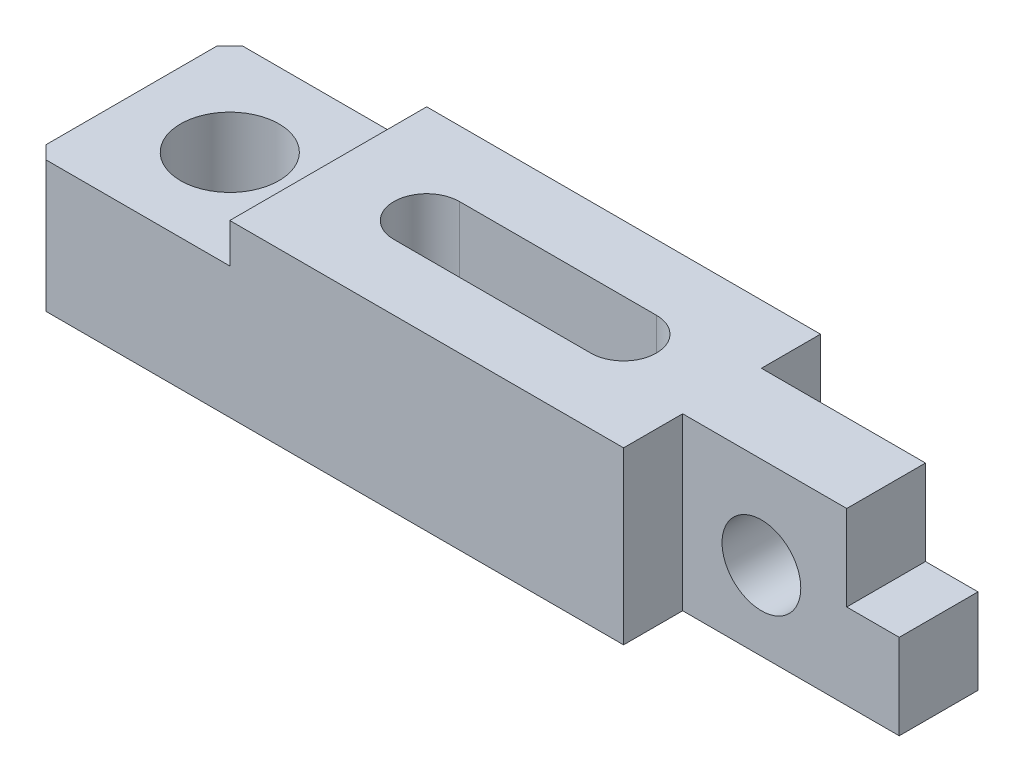
ISO-10303-21;
HEADER;
FILE_DESCRIPTION(('STEP AP214'),'2;1');
FILE_NAME('part.step','',(''),(''),'','','');
FILE_SCHEMA(('AUTOMOTIVE_DESIGN { 1 0 10303 214 1 1 1 1 }'));
ENDSEC;
DATA;
#1=APPLICATION_CONTEXT('core data for automotive mechanical design processes');
#2=APPLICATION_PROTOCOL_DEFINITION('international standard','automotive_design',2000,#1);
#3=PRODUCT_CONTEXT('',#1,'mechanical');
#4=PRODUCT('Part','Part','',(#3));
#5=PRODUCT_RELATED_PRODUCT_CATEGORY('part','',(#4));
#6=PRODUCT_DEFINITION_FORMATION('','',#4);
#7=PRODUCT_DEFINITION_CONTEXT('part definition',#1,'design');
#8=PRODUCT_DEFINITION('design','',#6,#7);
#9=PRODUCT_DEFINITION_SHAPE('','',#8);
#10=(LENGTH_UNIT() NAMED_UNIT(*) SI_UNIT(.MILLI.,.METRE.));
#11=(NAMED_UNIT(*) PLANE_ANGLE_UNIT() SI_UNIT($,.RADIAN.));
#12=(NAMED_UNIT(*) SI_UNIT($,.STERADIAN.) SOLID_ANGLE_UNIT());
#13=UNCERTAINTY_MEASURE_WITH_UNIT(LENGTH_MEASURE(1.E-05),#10,'distance_accuracy_value','');
#14=(GEOMETRIC_REPRESENTATION_CONTEXT(3) GLOBAL_UNCERTAINTY_ASSIGNED_CONTEXT((#13)) GLOBAL_UNIT_ASSIGNED_CONTEXT((#10,
#11,#12)) REPRESENTATION_CONTEXT('',''));
#15=CARTESIAN_POINT('',(0.,0.,0.));
#16=DIRECTION('',(0.,0.,1.));
#17=DIRECTION('',(1.,0.,0.));
#18=AXIS2_PLACEMENT_3D('',#15,#16,#17);
#19=CARTESIAN_POINT('',(123.,-0.001000000000001,6.));
#20=DIRECTION('',(0.,0.,-1.));
#21=DIRECTION('',(-1.,0.,0.));
#22=AXIS2_PLACEMENT_3D('',#19,#20,#21);
#23=PLANE('',#22);
#24=DIRECTION('',(1.,0.,0.));
#25=VECTOR('',#24,1.);
#26=CARTESIAN_POINT('',(123.,0.,6.));
#27=LINE('',#26,#25);
#28=CARTESIAN_POINT('',(90.,0.,6.));
#29=VERTEX_POINT('',#28);
#30=CARTESIAN_POINT('',(123.,0.,6.));
#31=VERTEX_POINT('',#30);
#32=EDGE_CURVE('E281',#29,#31,#27,.T.);
#33=ORIENTED_EDGE('',*,*,#32,.T.);
#34=DIRECTION('',(0.,1.,0.));
#35=VECTOR('',#34,1.);
#36=CARTESIAN_POINT('',(123.,-0.001000000000001,6.));
#37=LINE('',#36,#35);
#38=CARTESIAN_POINT('',(123.,13.,6.));
#39=VERTEX_POINT('',#38);
#40=EDGE_CURVE('E266',#31,#39,#37,.T.);
#41=ORIENTED_EDGE('',*,*,#40,.T.);
#42=DIRECTION('',(-1.,0.,0.));
#43=VECTOR('',#42,1.);
#44=CARTESIAN_POINT('',(123.,13.,6.));
#45=LINE('',#44,#43);
#46=CARTESIAN_POINT('',(115.,13.,6.));
#47=VERTEX_POINT('',#46);
#48=EDGE_CURVE('E284',#39,#47,#45,.T.);
#49=ORIENTED_EDGE('',*,*,#48,.T.);
#50=DIRECTION('',(0.,1.,0.));
#51=VECTOR('',#50,1.);
#52=CARTESIAN_POINT('',(115.,-0.001000000000001,6.));
#53=LINE('',#52,#51);
#54=CARTESIAN_POINT('',(115.,26.,6.));
#55=VERTEX_POINT('',#54);
#56=EDGE_CURVE('E232',#47,#55,#53,.T.);
#57=ORIENTED_EDGE('',*,*,#56,.T.);
#58=DIRECTION('',(-1.,0.,0.));
#59=VECTOR('',#58,1.);
#60=CARTESIAN_POINT('',(123.,26.,6.));
#61=LINE('',#60,#59);
#62=CARTESIAN_POINT('',(90.,26.,6.));
#63=VERTEX_POINT('',#62);
#64=EDGE_CURVE('E265',#55,#63,#61,.T.);
#65=ORIENTED_EDGE('',*,*,#64,.T.);
#66=DIRECTION('',(0.,1.,0.));
#67=VECTOR('',#66,1.);
#68=CARTESIAN_POINT('',(90.,-0.001000000000001,6.));
#69=LINE('',#68,#67);
#70=EDGE_CURVE('E195',#29,#63,#69,.T.);
#71=ORIENTED_EDGE('',*,*,#70,.F.);
#72=EDGE_LOOP('',(#33,#41,#49,#57,#65,#71));
#73=FACE_BOUND('',#72,.T.);
#74=CARTESIAN_POINT('',(102.,12.,6.00000000000002));
#75=DIRECTION('',(0.,0.,1.));
#76=DIRECTION('',(1.,0.,0.));
#77=AXIS2_PLACEMENT_3D('',#74,#75,#76);
#78=CIRCLE('',#77,6.00000000000001);
#79=CARTESIAN_POINT('',(108.,12.,6.00000000000002));
#80=VERTEX_POINT('',#79);
#81=EDGE_CURVE('E479',#80,#80,#78,.T.);
#82=ORIENTED_EDGE('',*,*,#81,.F.);
#83=EDGE_LOOP('',(#82));
#84=FACE_BOUND('',#83,.T.);
#85=ADVANCED_FACE('F45',(#73,#84),#23,.F.);
#86=CARTESIAN_POINT('',(0.,20.,15.));
#87=DIRECTION('',(0.,-1.,0.));
#88=DIRECTION('',(0.,0.,-1.));
#89=AXIS2_PLACEMENT_3D('',#86,#87,#88);
#90=PLANE('',#89);
#91=CARTESIAN_POINT('',(15.,20.,0.));
#92=DIRECTION('',(0.,1.,0.));
#93=DIRECTION('',(0.,0.,1.));
#94=AXIS2_PLACEMENT_3D('',#91,#92,#93);
#95=CIRCLE('',#94,7.49999999999999);
#96=CARTESIAN_POINT('',(15.,20.,7.49999999999999));
#97=VERTEX_POINT('',#96);
#98=EDGE_CURVE('E483',#97,#97,#95,.T.);
#99=ORIENTED_EDGE('',*,*,#98,.F.);
#100=EDGE_LOOP('',(#99));
#101=FACE_BOUND('',#100,.T.);
#102=DIRECTION('',(0.,0.,-1.));
#103=VECTOR('',#102,1.);
#104=CARTESIAN_POINT('',(0.,20.,15.));
#105=LINE('',#104,#103);
#106=CARTESIAN_POINT('',(0.,20.,13.));
#107=VERTEX_POINT('',#106);
#108=CARTESIAN_POINT('',(0.,20.,-13.));
#109=VERTEX_POINT('',#108);
#110=EDGE_CURVE('E341',#107,#109,#105,.T.);
#111=ORIENTED_EDGE('',*,*,#110,.F.);
#112=DIRECTION('',(0.70710678118655,0.,0.707106781186545));
#113=VECTOR('',#112,1.);
#114=CARTESIAN_POINT('',(2.,20.,15.));
#115=LINE('',#114,#113);
#116=CARTESIAN_POINT('',(2.,20.,15.));
#117=VERTEX_POINT('',#116);
#118=EDGE_CURVE('E55',#107,#117,#115,.T.);
#119=ORIENTED_EDGE('',*,*,#118,.T.);
#120=DIRECTION('',(-1.,0.,0.));
#121=VECTOR('',#120,1.);
#122=CARTESIAN_POINT('',(0.,20.,15.));
#123=LINE('',#122,#121);
#124=CARTESIAN_POINT('',(30.,20.,15.));
#125=VERTEX_POINT('',#124);
#126=EDGE_CURVE('E289',#125,#117,#123,.T.);
#127=ORIENTED_EDGE('',*,*,#126,.F.);
#128=DIRECTION('',(0.,0.,-1.));
#129=VECTOR('',#128,1.);
#130=CARTESIAN_POINT('',(30.,20.,15.));
#131=LINE('',#130,#129);
#132=CARTESIAN_POINT('',(30.,20.,-15.));
#133=VERTEX_POINT('',#132);
#134=EDGE_CURVE('E303',#125,#133,#131,.T.);
#135=ORIENTED_EDGE('',*,*,#134,.T.);
#136=DIRECTION('',(-1.,0.,0.));
#137=VECTOR('',#136,1.);
#138=CARTESIAN_POINT('',(0.,20.,-15.));
#139=LINE('',#138,#137);
#140=CARTESIAN_POINT('',(2.,20.,-15.));
#141=VERTEX_POINT('',#140);
#142=EDGE_CURVE('E254',#133,#141,#139,.T.);
#143=ORIENTED_EDGE('',*,*,#142,.T.);
#144=DIRECTION('',(0.70710678118655,0.,-0.707106781186545));
#145=VECTOR('',#144,1.);
#146=CARTESIAN_POINT('',(0.,20.,-13.));
#147=LINE('',#146,#145);
#148=EDGE_CURVE('E67',#141,#109,#147,.F.);
#149=ORIENTED_EDGE('',*,*,#148,.T.);
#150=EDGE_LOOP('',(#111,#119,#127,#135,#143,#149));
#151=FACE_BOUND('',#150,.T.);
#152=ADVANCED_FACE('F365',(#101,#151),#90,.F.);
#153=CARTESIAN_POINT('',(0.,0.,15.));
#154=DIRECTION('',(1.,0.,0.));
#155=DIRECTION('',(0.,0.,-1.));
#156=AXIS2_PLACEMENT_3D('',#153,#154,#155);
#157=PLANE('',#156);
#158=DIRECTION('',(0.,0.,-1.));
#159=VECTOR('',#158,1.);
#160=CARTESIAN_POINT('',(0.,0.,15.));
#161=LINE('',#160,#159);
#162=CARTESIAN_POINT('',(0.,0.,13.));
#163=VERTEX_POINT('',#162);
#164=CARTESIAN_POINT('',(0.,0.,-13.));
#165=VERTEX_POINT('',#164);
#166=EDGE_CURVE('E337',#163,#165,#161,.T.);
#167=ORIENTED_EDGE('',*,*,#166,.F.);
#168=DIRECTION('',(0.,1.,0.));
#169=VECTOR('',#168,1.);
#170=CARTESIAN_POINT('',(0.,20.,13.));
#171=LINE('',#170,#169);
#172=EDGE_CURVE('E358',#163,#107,#171,.T.);
#173=ORIENTED_EDGE('',*,*,#172,.T.);
#174=ORIENTED_EDGE('',*,*,#110,.T.);
#175=DIRECTION('',(0.,-1.,0.));
#176=VECTOR('',#175,1.);
#177=CARTESIAN_POINT('',(0.,0.,-13.));
#178=LINE('',#177,#176);
#179=EDGE_CURVE('E354',#109,#165,#178,.T.);
#180=ORIENTED_EDGE('',*,*,#179,.T.);
#181=EDGE_LOOP('',(#167,#173,#174,#180));
#182=FACE_BOUND('',#181,.T.);
#183=ADVANCED_FACE('F378',(#182),#157,.F.);
#184=CARTESIAN_POINT('',(123.,0.,15.));
#185=DIRECTION('',(0.,1.,0.));
#186=DIRECTION('',(-1.,0.,0.));
#187=AXIS2_PLACEMENT_3D('',#184,#185,#186);
#188=PLANE('',#187);
#189=CARTESIAN_POINT('',(15.,0.,0.));
#190=DIRECTION('',(0.,1.,0.));
#191=DIRECTION('',(0.,0.,1.));
#192=AXIS2_PLACEMENT_3D('',#189,#190,#191);
#193=CIRCLE('',#192,7.5);
#194=CARTESIAN_POINT('',(15.,0.,7.5));
#195=VERTEX_POINT('',#194);
#196=EDGE_CURVE('E489',#195,#195,#193,.T.);
#197=ORIENTED_EDGE('',*,*,#196,.T.);
#198=EDGE_LOOP('',(#197));
#199=FACE_BOUND('',#198,.T.);
#200=DIRECTION('',(1.,0.,0.));
#201=VECTOR('',#200,1.);
#202=CARTESIAN_POINT('',(45.,0.,-5.));
#203=LINE('',#202,#201);
#204=CARTESIAN_POINT('',(45.,0.,-5.));
#205=VERTEX_POINT('',#204);
#206=CARTESIAN_POINT('',(75.,0.,-5.));
#207=VERTEX_POINT('',#206);
#208=EDGE_CURVE('E201',#205,#207,#203,.T.);
#209=ORIENTED_EDGE('',*,*,#208,.F.);
#210=CARTESIAN_POINT('',(45.,0.,0.));
#211=DIRECTION('',(0.,1.,0.));
#212=DIRECTION('',(-1.,0.,0.));
#213=AXIS2_PLACEMENT_3D('',#210,#211,#212);
#214=CIRCLE('',#213,5.);
#215=CARTESIAN_POINT('',(45.,0.,5.));
#216=VERTEX_POINT('',#215);
#217=EDGE_CURVE('E177',#216,#205,#214,.F.);
#218=ORIENTED_EDGE('',*,*,#217,.F.);
#219=DIRECTION('',(-1.,0.,0.));
#220=VECTOR('',#219,1.);
#221=CARTESIAN_POINT('',(45.,0.,5.));
#222=LINE('',#221,#220);
#223=CARTESIAN_POINT('',(75.,0.,5.));
#224=VERTEX_POINT('',#223);
#225=EDGE_CURVE('E190',#224,#216,#222,.T.);
#226=ORIENTED_EDGE('',*,*,#225,.F.);
#227=CARTESIAN_POINT('',(75.,0.,0.));
#228=DIRECTION('',(0.,1.,0.));
#229=DIRECTION('',(-1.,0.,0.));
#230=AXIS2_PLACEMENT_3D('',#227,#228,#229);
#231=CIRCLE('',#230,5.);
#232=EDGE_CURVE('E208',#207,#224,#231,.F.);
#233=ORIENTED_EDGE('',*,*,#232,.F.);
#234=EDGE_LOOP('',(#209,#218,#226,#233));
#235=FACE_BOUND('',#234,.T.);
#236=DIRECTION('',(1.,0.,0.));
#237=VECTOR('',#236,1.);
#238=CARTESIAN_POINT('',(123.,0.,15.));
#239=LINE('',#238,#237);
#240=CARTESIAN_POINT('',(2.,0.,15.));
#241=VERTEX_POINT('',#240);
#242=CARTESIAN_POINT('',(90.,0.,15.));
#243=VERTEX_POINT('',#242);
#244=EDGE_CURVE('E293',#241,#243,#239,.T.);
#245=ORIENTED_EDGE('',*,*,#244,.F.);
#246=DIRECTION('',(-0.70710678118655,0.,-0.707106781186545));
#247=VECTOR('',#246,1.);
#248=CARTESIAN_POINT('',(2.,0.,15.));
#249=LINE('',#248,#247);
#250=EDGE_CURVE('E351',#241,#163,#249,.T.);
#251=ORIENTED_EDGE('',*,*,#250,.T.);
#252=ORIENTED_EDGE('',*,*,#166,.T.);
#253=DIRECTION('',(-0.70710678118655,0.,0.707106781186545));
#254=VECTOR('',#253,1.);
#255=CARTESIAN_POINT('',(0.,0.,-13.));
#256=LINE('',#255,#254);
#257=CARTESIAN_POINT('',(2.,0.,-15.));
#258=VERTEX_POINT('',#257);
#259=EDGE_CURVE('E348',#165,#258,#256,.F.);
#260=ORIENTED_EDGE('',*,*,#259,.T.);
#261=DIRECTION('',(1.,0.,0.));
#262=VECTOR('',#261,1.);
#263=CARTESIAN_POINT('',(123.,0.,-15.));
#264=LINE('',#263,#262);
#265=CARTESIAN_POINT('',(90.,0.,-15.));
#266=VERTEX_POINT('',#265);
#267=EDGE_CURVE('E306',#258,#266,#264,.T.);
#268=ORIENTED_EDGE('',*,*,#267,.T.);
#269=DIRECTION('',(0.,0.,-1.));
#270=VECTOR('',#269,1.);
#271=CARTESIAN_POINT('',(90.,0.,-15.));
#272=LINE('',#271,#270);
#273=CARTESIAN_POINT('',(90.,0.,-6.));
#274=VERTEX_POINT('',#273);
#275=EDGE_CURVE('E235',#274,#266,#272,.T.);
#276=ORIENTED_EDGE('',*,*,#275,.F.);
#277=DIRECTION('',(-1.,0.,0.));
#278=VECTOR('',#277,1.);
#279=CARTESIAN_POINT('',(90.,0.,-6.));
#280=LINE('',#279,#278);
#281=CARTESIAN_POINT('',(123.,0.,-6.));
#282=VERTEX_POINT('',#281);
#283=EDGE_CURVE('E239',#282,#274,#280,.T.);
#284=ORIENTED_EDGE('',*,*,#283,.F.);
#285=DIRECTION('',(0.,0.,-1.));
#286=VECTOR('',#285,1.);
#287=CARTESIAN_POINT('',(123.,0.,15.));
#288=LINE('',#287,#286);
#289=EDGE_CURVE('E333',#31,#282,#288,.T.);
#290=ORIENTED_EDGE('',*,*,#289,.F.);
#291=ORIENTED_EDGE('',*,*,#32,.F.);
#292=DIRECTION('',(0.,0.,-1.));
#293=VECTOR('',#292,1.);
#294=CARTESIAN_POINT('',(90.,0.,6.));
#295=LINE('',#294,#293);
#296=EDGE_CURVE('E277',#243,#29,#295,.T.);
#297=ORIENTED_EDGE('',*,*,#296,.F.);
#298=EDGE_LOOP('',(#245,#251,#252,#260,#268,#276,#284,#290,#291,#297));
#299=FACE_BOUND('',#298,.T.);
#300=ADVANCED_FACE('F198',(#199,#235,#299),#188,.F.);
#301=CARTESIAN_POINT('',(123.,13.,15.));
#302=DIRECTION('',(-1.,0.,0.));
#303=DIRECTION('',(0.,0.,1.));
#304=AXIS2_PLACEMENT_3D('',#301,#302,#303);
#305=PLANE('',#304);
#306=ORIENTED_EDGE('',*,*,#289,.T.);
#307=DIRECTION('',(0.,1.,0.));
#308=VECTOR('',#307,1.);
#309=CARTESIAN_POINT('',(123.,-0.001000000000001,-6.));
#310=LINE('',#309,#308);
#311=CARTESIAN_POINT('',(123.,13.,-6.));
#312=VERTEX_POINT('',#311);
#313=EDGE_CURVE('E250',#282,#312,#310,.T.);
#314=ORIENTED_EDGE('',*,*,#313,.T.);
#315=DIRECTION('',(0.,0.,-1.));
#316=VECTOR('',#315,1.);
#317=CARTESIAN_POINT('',(123.,13.,15.));
#318=LINE('',#317,#316);
#319=EDGE_CURVE('E329',#39,#312,#318,.T.);
#320=ORIENTED_EDGE('',*,*,#319,.F.);
#321=ORIENTED_EDGE('',*,*,#40,.F.);
#322=EDGE_LOOP('',(#306,#314,#320,#321));
#323=FACE_BOUND('',#322,.T.);
#324=ADVANCED_FACE('F409',(#323),#305,.F.);
#325=CARTESIAN_POINT('',(115.,13.,15.));
#326=DIRECTION('',(0.,-1.,0.));
#327=DIRECTION('',(0.,0.,-1.));
#328=AXIS2_PLACEMENT_3D('',#325,#326,#327);
#329=PLANE('',#328);
#330=ORIENTED_EDGE('',*,*,#319,.T.);
#331=DIRECTION('',(1.,0.,0.));
#332=VECTOR('',#331,1.);
#333=CARTESIAN_POINT('',(90.,13.,-6.));
#334=LINE('',#333,#332);
#335=CARTESIAN_POINT('',(115.,13.,-6.));
#336=VERTEX_POINT('',#335);
#337=EDGE_CURVE('E231',#336,#312,#334,.T.);
#338=ORIENTED_EDGE('',*,*,#337,.F.);
#339=DIRECTION('',(0.,0.,-1.));
#340=VECTOR('',#339,1.);
#341=CARTESIAN_POINT('',(115.,13.,15.));
#342=LINE('',#341,#340);
#343=EDGE_CURVE('E325',#47,#336,#342,.T.);
#344=ORIENTED_EDGE('',*,*,#343,.F.);
#345=ORIENTED_EDGE('',*,*,#48,.F.);
#346=EDGE_LOOP('',(#330,#338,#344,#345));
#347=FACE_BOUND('',#346,.T.);
#348=ADVANCED_FACE('F405',(#347),#329,.F.);
#349=CARTESIAN_POINT('',(115.,26.,15.));
#350=DIRECTION('',(-1.,0.,0.));
#351=DIRECTION('',(0.,0.,1.));
#352=AXIS2_PLACEMENT_3D('',#349,#350,#351);
#353=PLANE('',#352);
#354=ORIENTED_EDGE('',*,*,#343,.T.);
#355=DIRECTION('',(0.,-1.,0.));
#356=VECTOR('',#355,1.);
#357=CARTESIAN_POINT('',(115.,-0.001000000000001,-6.));
#358=LINE('',#357,#356);
#359=CARTESIAN_POINT('',(115.,26.,-6.));
#360=VERTEX_POINT('',#359);
#361=EDGE_CURVE('E228',#360,#336,#358,.T.);
#362=ORIENTED_EDGE('',*,*,#361,.F.);
#363=DIRECTION('',(0.,0.,-1.));
#364=VECTOR('',#363,1.);
#365=CARTESIAN_POINT('',(115.,26.,15.));
#366=LINE('',#365,#364);
#367=EDGE_CURVE('E321',#55,#360,#366,.T.);
#368=ORIENTED_EDGE('',*,*,#367,.F.);
#369=ORIENTED_EDGE('',*,*,#56,.F.);
#370=EDGE_LOOP('',(#354,#362,#368,#369));
#371=FACE_BOUND('',#370,.T.);
#372=ADVANCED_FACE('F400',(#371),#353,.F.);
#373=CARTESIAN_POINT('',(30.,26.,15.));
#374=DIRECTION('',(0.,-1.,0.));
#375=DIRECTION('',(0.,0.,-1.));
#376=AXIS2_PLACEMENT_3D('',#373,#374,#375);
#377=PLANE('',#376);
#378=DIRECTION('',(1.,0.,0.));
#379=VECTOR('',#378,1.);
#380=CARTESIAN_POINT('',(45.,26.,5.));
#381=LINE('',#380,#379);
#382=CARTESIAN_POINT('',(45.,26.,5.));
#383=VERTEX_POINT('',#382);
#384=CARTESIAN_POINT('',(75.,26.,5.));
#385=VERTEX_POINT('',#384);
#386=EDGE_CURVE('E206',#383,#385,#381,.T.);
#387=ORIENTED_EDGE('',*,*,#386,.F.);
#388=CARTESIAN_POINT('',(45.,26.,0.));
#389=DIRECTION('',(0.,1.,0.));
#390=DIRECTION('',(0.,0.,1.));
#391=AXIS2_PLACEMENT_3D('',#388,#389,#390);
#392=CIRCLE('',#391,5.);
#393=CARTESIAN_POINT('',(45.,26.,-5.));
#394=VERTEX_POINT('',#393);
#395=EDGE_CURVE('E180',#394,#383,#392,.T.);
#396=ORIENTED_EDGE('',*,*,#395,.F.);
#397=DIRECTION('',(-1.,0.,0.));
#398=VECTOR('',#397,1.);
#399=CARTESIAN_POINT('',(45.,26.,-5.));
#400=LINE('',#399,#398);
#401=CARTESIAN_POINT('',(75.,26.,-5.));
#402=VERTEX_POINT('',#401);
#403=EDGE_CURVE('E186',#402,#394,#400,.T.);
#404=ORIENTED_EDGE('',*,*,#403,.F.);
#405=CARTESIAN_POINT('',(75.,26.,0.));
#406=DIRECTION('',(0.,1.,0.));
#407=DIRECTION('',(0.,0.,1.));
#408=AXIS2_PLACEMENT_3D('',#405,#406,#407);
#409=CIRCLE('',#408,5.);
#410=EDGE_CURVE('E214',#385,#402,#409,.T.);
#411=ORIENTED_EDGE('',*,*,#410,.F.);
#412=EDGE_LOOP('',(#387,#396,#404,#411));
#413=FACE_BOUND('',#412,.T.);
#414=ORIENTED_EDGE('',*,*,#367,.T.);
#415=DIRECTION('',(1.,0.,0.));
#416=VECTOR('',#415,1.);
#417=CARTESIAN_POINT('',(90.,26.,-6.));
#418=LINE('',#417,#416);
#419=CARTESIAN_POINT('',(90.,26.,-6.));
#420=VERTEX_POINT('',#419);
#421=EDGE_CURVE('E243',#420,#360,#418,.T.);
#422=ORIENTED_EDGE('',*,*,#421,.F.);
#423=DIRECTION('',(0.,0.,1.));
#424=VECTOR('',#423,1.);
#425=CARTESIAN_POINT('',(90.,26.,-15.));
#426=LINE('',#425,#424);
#427=CARTESIAN_POINT('',(90.,26.,-15.));
#428=VERTEX_POINT('',#427);
#429=EDGE_CURVE('E246',#428,#420,#426,.T.);
#430=ORIENTED_EDGE('',*,*,#429,.F.);
#431=DIRECTION('',(-1.,0.,0.));
#432=VECTOR('',#431,1.);
#433=CARTESIAN_POINT('',(30.,26.,-15.));
#434=LINE('',#433,#432);
#435=CARTESIAN_POINT('',(30.,26.,-15.));
#436=VERTEX_POINT('',#435);
#437=EDGE_CURVE('E309',#428,#436,#434,.T.);
#438=ORIENTED_EDGE('',*,*,#437,.T.);
#439=DIRECTION('',(0.,0.,-1.));
#440=VECTOR('',#439,1.);
#441=CARTESIAN_POINT('',(30.,26.,15.));
#442=LINE('',#441,#440);
#443=CARTESIAN_POINT('',(30.,26.,15.));
#444=VERTEX_POINT('',#443);
#445=EDGE_CURVE('E317',#444,#436,#442,.T.);
#446=ORIENTED_EDGE('',*,*,#445,.F.);
#447=DIRECTION('',(-1.,0.,0.));
#448=VECTOR('',#447,1.);
#449=CARTESIAN_POINT('',(30.,26.,15.));
#450=LINE('',#449,#448);
#451=CARTESIAN_POINT('',(90.,26.,15.));
#452=VERTEX_POINT('',#451);
#453=EDGE_CURVE('E297',#452,#444,#450,.T.);
#454=ORIENTED_EDGE('',*,*,#453,.F.);
#455=DIRECTION('',(0.,0.,1.));
#456=VECTOR('',#455,1.);
#457=CARTESIAN_POINT('',(90.,26.,6.));
#458=LINE('',#457,#456);
#459=EDGE_CURVE('E274',#63,#452,#458,.T.);
#460=ORIENTED_EDGE('',*,*,#459,.F.);
#461=ORIENTED_EDGE('',*,*,#64,.F.);
#462=EDGE_LOOP('',(#414,#422,#430,#438,#446,#454,#460,#461));
#463=FACE_BOUND('',#462,.T.);
#464=ADVANCED_FACE('F391',(#413,#463),#377,.F.);
#465=CARTESIAN_POINT('',(30.,20.,15.));
#466=DIRECTION('',(1.,0.,0.));
#467=DIRECTION('',(0.,0.,-1.));
#468=AXIS2_PLACEMENT_3D('',#465,#466,#467);
#469=PLANE('',#468);
#470=DIRECTION('',(0.,-1.,0.));
#471=VECTOR('',#470,1.);
#472=CARTESIAN_POINT('',(30.,20.,-15.));
#473=LINE('',#472,#471);
#474=EDGE_CURVE('E294',#436,#133,#473,.T.);
#475=ORIENTED_EDGE('',*,*,#474,.T.);
#476=ORIENTED_EDGE('',*,*,#134,.F.);
#477=DIRECTION('',(0.,-1.,0.));
#478=VECTOR('',#477,1.);
#479=CARTESIAN_POINT('',(30.,20.,15.));
#480=LINE('',#479,#478);
#481=EDGE_CURVE('E300',#444,#125,#480,.T.);
#482=ORIENTED_EDGE('',*,*,#481,.F.);
#483=ORIENTED_EDGE('',*,*,#445,.T.);
#484=EDGE_LOOP('',(#475,#476,#482,#483));
#485=FACE_BOUND('',#484,.T.);
#486=ADVANCED_FACE('F421',(#485),#469,.F.);
#487=CARTESIAN_POINT('',(0.,0.,15.));
#488=DIRECTION('',(0.,0.,1.));
#489=DIRECTION('',(1.,0.,0.));
#490=AXIS2_PLACEMENT_3D('',#487,#488,#489);
#491=PLANE('',#490);
#492=ORIENTED_EDGE('',*,*,#126,.T.);
#493=DIRECTION('',(0.,-1.,0.));
#494=VECTOR('',#493,1.);
#495=CARTESIAN_POINT('',(2.,0.,15.));
#496=LINE('',#495,#494);
#497=EDGE_CURVE('E344',#117,#241,#496,.T.);
#498=ORIENTED_EDGE('',*,*,#497,.T.);
#499=ORIENTED_EDGE('',*,*,#244,.T.);
#500=DIRECTION('',(0.,1.,0.));
#501=VECTOR('',#500,1.);
#502=CARTESIAN_POINT('',(90.,-0.001000000000001,15.));
#503=LINE('',#502,#501);
#504=EDGE_CURVE('E261',#243,#452,#503,.T.);
#505=ORIENTED_EDGE('',*,*,#504,.T.);
#506=ORIENTED_EDGE('',*,*,#453,.T.);
#507=ORIENTED_EDGE('',*,*,#481,.T.);
#508=EDGE_LOOP('',(#492,#498,#499,#505,#506,#507));
#509=FACE_BOUND('',#508,.T.);
#510=ADVANCED_FACE('F370',(#509),#491,.T.);
#511=CARTESIAN_POINT('',(0.,0.,-15.));
#512=DIRECTION('',(0.,0.,1.));
#513=DIRECTION('',(1.,0.,0.));
#514=AXIS2_PLACEMENT_3D('',#511,#512,#513);
#515=PLANE('',#514);
#516=ORIENTED_EDGE('',*,*,#267,.F.);
#517=DIRECTION('',(0.,1.,0.));
#518=VECTOR('',#517,1.);
#519=CARTESIAN_POINT('',(2.,0.,-15.));
#520=LINE('',#519,#518);
#521=EDGE_CURVE('E11',#258,#141,#520,.T.);
#522=ORIENTED_EDGE('',*,*,#521,.T.);
#523=ORIENTED_EDGE('',*,*,#142,.F.);
#524=ORIENTED_EDGE('',*,*,#474,.F.);
#525=ORIENTED_EDGE('',*,*,#437,.F.);
#526=DIRECTION('',(0.,1.,0.));
#527=VECTOR('',#526,1.);
#528=CARTESIAN_POINT('',(90.,-0.001000000000001,-15.));
#529=LINE('',#528,#527);
#530=EDGE_CURVE('E255',#266,#428,#529,.T.);
#531=ORIENTED_EDGE('',*,*,#530,.F.);
#532=EDGE_LOOP('',(#516,#522,#523,#524,#525,#531));
#533=FACE_BOUND('',#532,.T.);
#534=ADVANCED_FACE('F383',(#533),#515,.F.);
#535=CARTESIAN_POINT('',(90.,-0.001000000000001,-6.));
#536=DIRECTION('',(0.,0.,1.));
#537=DIRECTION('',(1.,0.,0.));
#538=AXIS2_PLACEMENT_3D('',#535,#536,#537);
#539=PLANE('',#538);
#540=CARTESIAN_POINT('',(102.,12.,-6.));
#541=DIRECTION('',(0.,0.,1.));
#542=DIRECTION('',(1.,0.,0.));
#543=AXIS2_PLACEMENT_3D('',#540,#541,#542);
#544=CIRCLE('',#543,6.);
#545=CARTESIAN_POINT('',(108.,12.,-6.));
#546=VERTEX_POINT('',#545);
#547=EDGE_CURVE('E476',#546,#546,#544,.T.);
#548=ORIENTED_EDGE('',*,*,#547,.T.);
#549=EDGE_LOOP('',(#548));
#550=FACE_BOUND('',#549,.T.);
#551=ORIENTED_EDGE('',*,*,#283,.T.);
#552=DIRECTION('',(0.,1.,0.));
#553=VECTOR('',#552,1.);
#554=CARTESIAN_POINT('',(90.,-0.001000000000001,-6.));
#555=LINE('',#554,#553);
#556=EDGE_CURVE('E251',#274,#420,#555,.T.);
#557=ORIENTED_EDGE('',*,*,#556,.T.);
#558=ORIENTED_EDGE('',*,*,#421,.T.);
#559=ORIENTED_EDGE('',*,*,#361,.T.);
#560=ORIENTED_EDGE('',*,*,#337,.T.);
#561=ORIENTED_EDGE('',*,*,#313,.F.);
#562=EDGE_LOOP('',(#551,#557,#558,#559,#560,#561));
#563=FACE_BOUND('',#562,.T.);
#564=ADVANCED_FACE('F397',(#550,#563),#539,.F.);
#565=CARTESIAN_POINT('',(90.,-0.001000000000001,-15.));
#566=DIRECTION('',(-1.,0.,0.));
#567=DIRECTION('',(0.,0.,1.));
#568=AXIS2_PLACEMENT_3D('',#565,#566,#567);
#569=PLANE('',#568);
#570=ORIENTED_EDGE('',*,*,#275,.T.);
#571=ORIENTED_EDGE('',*,*,#530,.T.);
#572=ORIENTED_EDGE('',*,*,#429,.T.);
#573=ORIENTED_EDGE('',*,*,#556,.F.);
#574=EDGE_LOOP('',(#570,#571,#572,#573));
#575=FACE_BOUND('',#574,.T.);
#576=ADVANCED_FACE('F388',(#575),#569,.F.);
#577=CARTESIAN_POINT('',(90.,-0.001000000000001,6.));
#578=DIRECTION('',(-1.,0.,0.));
#579=DIRECTION('',(0.,0.,1.));
#580=AXIS2_PLACEMENT_3D('',#577,#578,#579);
#581=PLANE('',#580);
#582=ORIENTED_EDGE('',*,*,#296,.T.);
#583=ORIENTED_EDGE('',*,*,#70,.T.);
#584=ORIENTED_EDGE('',*,*,#459,.T.);
#585=ORIENTED_EDGE('',*,*,#504,.F.);
#586=EDGE_LOOP('',(#582,#583,#584,#585));
#587=FACE_BOUND('',#586,.T.);
#588=ADVANCED_FACE('F418',(#587),#581,.F.);
#589=CARTESIAN_POINT('',(45.,-0.001000000000001,0.));
#590=DIRECTION('',(0.,1.,0.));
#591=DIRECTION('',(0.,0.,1.));
#592=AXIS2_PLACEMENT_3D('',#589,#590,#591);
#593=CYLINDRICAL_SURFACE('',#592,5.);
#594=ORIENTED_EDGE('',*,*,#217,.T.);
#595=DIRECTION('',(0.,1.,0.));
#596=VECTOR('',#595,1.);
#597=CARTESIAN_POINT('',(45.,-0.001000000000001,-5.));
#598=LINE('',#597,#596);
#599=EDGE_CURVE('E196',#205,#394,#598,.T.);
#600=ORIENTED_EDGE('',*,*,#599,.T.);
#601=ORIENTED_EDGE('',*,*,#395,.T.);
#602=DIRECTION('',(0.,1.,0.));
#603=VECTOR('',#602,1.);
#604=CARTESIAN_POINT('',(45.,-0.001000000000001,5.));
#605=LINE('',#604,#603);
#606=EDGE_CURVE('E173',#216,#383,#605,.T.);
#607=ORIENTED_EDGE('',*,*,#606,.F.);
#608=EDGE_LOOP('',(#594,#600,#601,#607));
#609=FACE_BOUND('',#608,.T.);
#610=ADVANCED_FACE('F175',(#609),#593,.F.);
#611=CARTESIAN_POINT('',(45.,-0.001000000000001,-5.));
#612=DIRECTION('',(0.,0.,-1.));
#613=DIRECTION('',(-1.,0.,0.));
#614=AXIS2_PLACEMENT_3D('',#611,#612,#613);
#615=PLANE('',#614);
#616=ORIENTED_EDGE('',*,*,#208,.T.);
#617=DIRECTION('',(0.,1.,0.));
#618=VECTOR('',#617,1.);
#619=CARTESIAN_POINT('',(75.,-0.001000000000001,-5.));
#620=LINE('',#619,#618);
#621=EDGE_CURVE('E223',#207,#402,#620,.T.);
#622=ORIENTED_EDGE('',*,*,#621,.T.);
#623=ORIENTED_EDGE('',*,*,#403,.T.);
#624=ORIENTED_EDGE('',*,*,#599,.F.);
#625=EDGE_LOOP('',(#616,#622,#623,#624));
#626=FACE_BOUND('',#625,.T.);
#627=ADVANCED_FACE('F454',(#626),#615,.F.);
#628=CARTESIAN_POINT('',(75.,-0.001000000000001,0.));
#629=DIRECTION('',(0.,1.,0.));
#630=DIRECTION('',(0.,0.,1.));
#631=AXIS2_PLACEMENT_3D('',#628,#629,#630);
#632=CYLINDRICAL_SURFACE('',#631,5.);
#633=ORIENTED_EDGE('',*,*,#232,.T.);
#634=DIRECTION('',(0.,1.,0.));
#635=VECTOR('',#634,1.);
#636=CARTESIAN_POINT('',(75.,-0.001000000000001,5.));
#637=LINE('',#636,#635);
#638=EDGE_CURVE('E185',#224,#385,#637,.T.);
#639=ORIENTED_EDGE('',*,*,#638,.T.);
#640=ORIENTED_EDGE('',*,*,#410,.T.);
#641=ORIENTED_EDGE('',*,*,#621,.F.);
#642=EDGE_LOOP('',(#633,#639,#640,#641));
#643=FACE_BOUND('',#642,.T.);
#644=ADVANCED_FACE('F458',(#643),#632,.F.);
#645=CARTESIAN_POINT('',(45.,-0.001000000000001,5.));
#646=DIRECTION('',(0.,0.,1.));
#647=DIRECTION('',(1.,0.,0.));
#648=AXIS2_PLACEMENT_3D('',#645,#646,#647);
#649=PLANE('',#648);
#650=ORIENTED_EDGE('',*,*,#225,.T.);
#651=ORIENTED_EDGE('',*,*,#606,.T.);
#652=ORIENTED_EDGE('',*,*,#386,.T.);
#653=ORIENTED_EDGE('',*,*,#638,.F.);
#654=EDGE_LOOP('',(#650,#651,#652,#653));
#655=FACE_BOUND('',#654,.T.);
#656=ADVANCED_FACE('F191',(#655),#649,.F.);
#657=CARTESIAN_POINT('',(15.,20.,0.));
#658=DIRECTION('',(0.,1.,0.));
#659=DIRECTION('',(0.,0.,1.));
#660=AXIS2_PLACEMENT_3D('',#657,#658,#659);
#661=CYLINDRICAL_SURFACE('',#660,7.49999999999999);
#662=ORIENTED_EDGE('',*,*,#196,.F.);
#663=EDGE_LOOP('',(#662));
#664=FACE_BOUND('',#663,.T.);
#665=ORIENTED_EDGE('',*,*,#98,.T.);
#666=EDGE_LOOP('',(#665));
#667=FACE_BOUND('',#666,.T.);
#668=ADVANCED_FACE('F457',(#664,#667),#661,.F.);
#669=CARTESIAN_POINT('',(102.,12.,6.00000000000002));
#670=DIRECTION('',(0.,0.,1.));
#671=DIRECTION('',(1.,0.,0.));
#672=AXIS2_PLACEMENT_3D('',#669,#670,#671);
#673=CYLINDRICAL_SURFACE('',#672,6.);
#674=ORIENTED_EDGE('',*,*,#547,.F.);
#675=EDGE_LOOP('',(#674));
#676=FACE_BOUND('',#675,.T.);
#677=ORIENTED_EDGE('',*,*,#81,.T.);
#678=EDGE_LOOP('',(#677));
#679=FACE_BOUND('',#678,.T.);
#680=ADVANCED_FACE('F467',(#676,#679),#673,.F.);
#681=CARTESIAN_POINT('',(2.,0.,15.));
#682=DIRECTION('',(-0.707106781186545,0.,0.70710678118655));
#683=DIRECTION('',(0.,1.,0.));
#684=AXIS2_PLACEMENT_3D('',#681,#682,#683);
#685=PLANE('',#684);
#686=ORIENTED_EDGE('',*,*,#118,.F.);
#687=ORIENTED_EDGE('',*,*,#172,.F.);
#688=ORIENTED_EDGE('',*,*,#250,.F.);
#689=ORIENTED_EDGE('',*,*,#497,.F.);
#690=EDGE_LOOP('',(#686,#687,#688,#689));
#691=FACE_BOUND('',#690,.T.);
#692=ADVANCED_FACE('F374',(#691),#685,.T.);
#693=CARTESIAN_POINT('',(0.,0.,-13.));
#694=DIRECTION('',(0.707106781186545,0.,0.70710678118655));
#695=DIRECTION('',(0.,-1.,0.));
#696=AXIS2_PLACEMENT_3D('',#693,#694,#695);
#697=PLANE('',#696);
#698=ORIENTED_EDGE('',*,*,#148,.F.);
#699=ORIENTED_EDGE('',*,*,#521,.F.);
#700=ORIENTED_EDGE('',*,*,#259,.F.);
#701=ORIENTED_EDGE('',*,*,#179,.F.);
#702=EDGE_LOOP('',(#698,#699,#700,#701));
#703=FACE_BOUND('',#702,.T.);
#704=ADVANCED_FACE('F48',(#703),#697,.F.);
#705=CLOSED_SHELL('',(#85,#152,#183,#300,#324,#348,#372,#464,#486,#510,#534,#564,#576,#588,#610,
#627,#644,#656,#668,#680,#692,#704));
#706=MANIFOLD_SOLID_BREP('B2',#705);
#707=ADVANCED_BREP_SHAPE_REPRESENTATION('',(#18,#706),#14);
#708=SHAPE_DEFINITION_REPRESENTATION(#9,#707);
ENDSEC;
END-ISO-10303-21;
